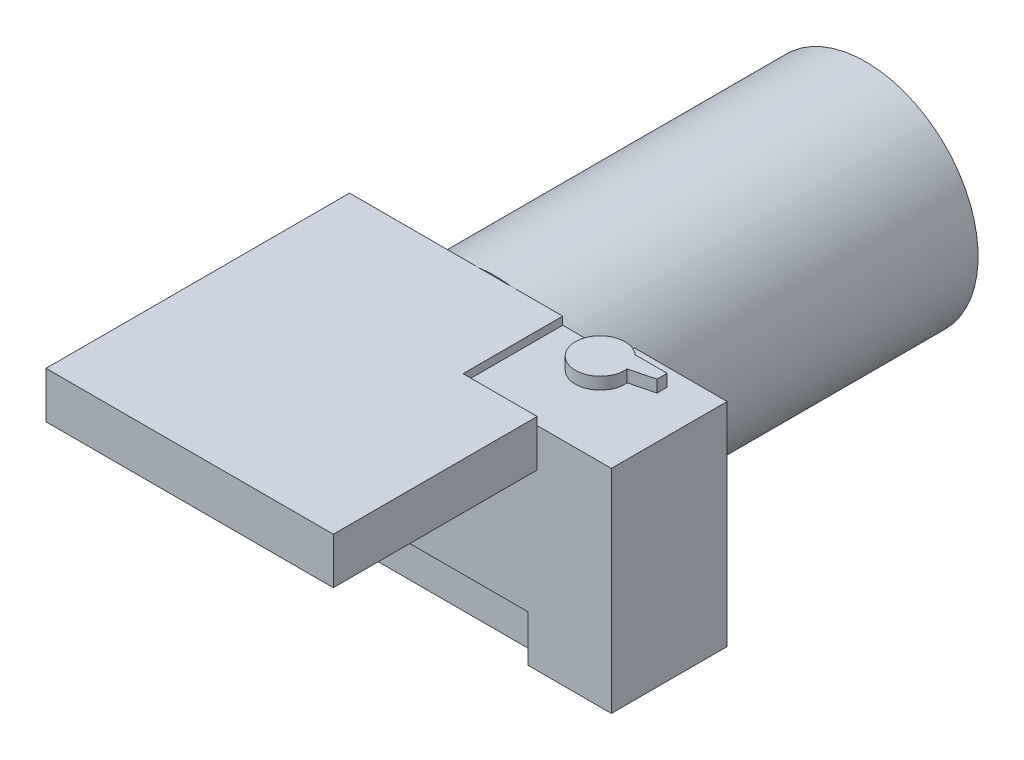
ISO-10303-21;
HEADER;
FILE_DESCRIPTION(('STEP AP214'),'2;1');
FILE_NAME('part.step','',(''),(''),'','','');
FILE_SCHEMA(('AUTOMOTIVE_DESIGN { 1 0 10303 214 1 1 1 1 }'));
ENDSEC;
DATA;
#1=APPLICATION_CONTEXT('core data for automotive mechanical design processes');
#2=APPLICATION_PROTOCOL_DEFINITION('international standard','automotive_design',2000,#1);
#3=PRODUCT_CONTEXT('',#1,'mechanical');
#4=PRODUCT('Part','Part','',(#3));
#5=PRODUCT_RELATED_PRODUCT_CATEGORY('part','',(#4));
#6=PRODUCT_DEFINITION_FORMATION('','',#4);
#7=PRODUCT_DEFINITION_CONTEXT('part definition',#1,'design');
#8=PRODUCT_DEFINITION('design','',#6,#7);
#9=PRODUCT_DEFINITION_SHAPE('','',#8);
#10=(LENGTH_UNIT() NAMED_UNIT(*) SI_UNIT(.MILLI.,.METRE.));
#11=(NAMED_UNIT(*) PLANE_ANGLE_UNIT() SI_UNIT($,.RADIAN.));
#12=(NAMED_UNIT(*) SI_UNIT($,.STERADIAN.) SOLID_ANGLE_UNIT());
#13=UNCERTAINTY_MEASURE_WITH_UNIT(LENGTH_MEASURE(1.E-05),#10,'distance_accuracy_value','');
#14=(GEOMETRIC_REPRESENTATION_CONTEXT(3) GLOBAL_UNCERTAINTY_ASSIGNED_CONTEXT((#13)) GLOBAL_UNIT_ASSIGNED_CONTEXT((#10,
#11,#12)) REPRESENTATION_CONTEXT('',''));
#15=CARTESIAN_POINT('',(0.,0.,0.));
#16=DIRECTION('',(0.,0.,1.));
#17=DIRECTION('',(1.,0.,0.));
#18=AXIS2_PLACEMENT_3D('',#15,#16,#17);
#19=CARTESIAN_POINT('',(0.,58.166,0.));
#20=DIRECTION('',(0.,0.,-1.));
#21=DIRECTION('',(-1.,0.,0.));
#22=AXIS2_PLACEMENT_3D('',#19,#20,#21);
#23=PLANE('',#22);
#24=DIRECTION('',(0.,1.,0.));
#25=VECTOR('',#24,1.);
#26=CARTESIAN_POINT('',(78.74,47.625,0.));
#27=LINE('',#26,#25);
#28=CARTESIAN_POINT('',(78.74,47.625,0.));
#29=VERTEX_POINT('',#28);
#30=CARTESIAN_POINT('',(78.74,58.166,0.));
#31=VERTEX_POINT('',#30);
#32=EDGE_CURVE('E387',#29,#31,#27,.T.);
#33=ORIENTED_EDGE('',*,*,#32,.F.);
#34=DIRECTION('',(-1.,0.,0.));
#35=VECTOR('',#34,1.);
#36=CARTESIAN_POINT('',(0.,47.625,0.));
#37=LINE('',#36,#35);
#38=CARTESIAN_POINT('',(0.,47.625,0.));
#39=VERTEX_POINT('',#38);
#40=EDGE_CURVE('E206',#29,#39,#37,.T.);
#41=ORIENTED_EDGE('',*,*,#40,.T.);
#42=DIRECTION('',(0.,-1.,0.));
#43=VECTOR('',#42,1.);
#44=CARTESIAN_POINT('',(0.,58.166,0.));
#45=LINE('',#44,#43);
#46=CARTESIAN_POINT('',(0.,12.7,0.));
#47=VERTEX_POINT('',#46);
#48=EDGE_CURVE('E215',#39,#47,#45,.T.);
#49=ORIENTED_EDGE('',*,*,#48,.T.);
#50=DIRECTION('',(1.,0.,0.));
#51=VECTOR('',#50,1.);
#52=CARTESIAN_POINT('',(0.,12.7,0.));
#53=LINE('',#52,#51);
#54=CARTESIAN_POINT('',(76.2,12.7,0.));
#55=VERTEX_POINT('',#54);
#56=EDGE_CURVE('E395',#47,#55,#53,.T.);
#57=ORIENTED_EDGE('',*,*,#56,.T.);
#58=DIRECTION('',(0.,-1.,0.));
#59=VECTOR('',#58,1.);
#60=CARTESIAN_POINT('',(76.2,12.7,0.));
#61=LINE('',#60,#59);
#62=CARTESIAN_POINT('',(76.2,0.,0.));
#63=VERTEX_POINT('',#62);
#64=EDGE_CURVE('E244',#55,#63,#61,.T.);
#65=ORIENTED_EDGE('',*,*,#64,.T.);
#66=DIRECTION('',(1.,0.,0.));
#67=VECTOR('',#66,1.);
#68=CARTESIAN_POINT('',(0.,0.,0.));
#69=LINE('',#68,#67);
#70=CARTESIAN_POINT('',(99.06,0.,0.));
#71=VERTEX_POINT('',#70);
#72=EDGE_CURVE('E306',#63,#71,#69,.T.);
#73=ORIENTED_EDGE('',*,*,#72,.T.);
#74=DIRECTION('',(0.,-1.,0.));
#75=VECTOR('',#74,1.);
#76=CARTESIAN_POINT('',(99.06,58.166,0.));
#77=LINE('',#76,#75);
#78=CARTESIAN_POINT('',(99.06,58.166,0.));
#79=VERTEX_POINT('',#78);
#80=EDGE_CURVE('E356',#79,#71,#77,.T.);
#81=ORIENTED_EDGE('',*,*,#80,.F.);
#82=DIRECTION('',(1.,0.,0.));
#83=VECTOR('',#82,1.);
#84=CARTESIAN_POINT('',(0.,58.166,0.));
#85=LINE('',#84,#83);
#86=EDGE_CURVE('E313',#31,#79,#85,.T.);
#87=ORIENTED_EDGE('',*,*,#86,.F.);
#88=EDGE_LOOP('',(#33,#41,#49,#57,#65,#73,#81,#87));
#89=FACE_BOUND('',#88,.T.);
#90=ADVANCED_FACE('F35',(#89),#23,.F.);
#91=CARTESIAN_POINT('',(0.,0.,0.));
#92=DIRECTION('',(0.,1.,0.));
#93=DIRECTION('',(0.,0.,1.));
#94=AXIS2_PLACEMENT_3D('',#91,#92,#93);
#95=PLANE('',#94);
#96=CARTESIAN_POINT('',(39.878,0.,-17.145));
#97=DIRECTION('',(0.,-1.,0.));
#98=DIRECTION('',(0.,0.,-1.));
#99=AXIS2_PLACEMENT_3D('',#96,#97,#98);
#100=CIRCLE('',#99,3.175);
#101=CARTESIAN_POINT('',(39.878,0.,-20.32));
#102=VERTEX_POINT('',#101);
#103=EDGE_CURVE('E297',#102,#102,#100,.T.);
#104=ORIENTED_EDGE('',*,*,#103,.F.);
#105=EDGE_LOOP('',(#104));
#106=FACE_BOUND('',#105,.T.);
#107=DIRECTION('',(0.,0.,-1.));
#108=VECTOR('',#107,1.);
#109=CARTESIAN_POINT('',(76.2,0.,0.));
#110=LINE('',#109,#108);
#111=CARTESIAN_POINT('',(76.2,0.,-4.064));
#112=VERTEX_POINT('',#111);
#113=EDGE_CURVE('E385',#63,#112,#110,.T.);
#114=ORIENTED_EDGE('',*,*,#113,.T.);
#115=DIRECTION('',(1.,0.,0.));
#116=VECTOR('',#115,1.);
#117=CARTESIAN_POINT('',(0.,0.,-4.064));
#118=LINE('',#117,#116);
#119=CARTESIAN_POINT('',(0.,0.,-4.064));
#120=VERTEX_POINT('',#119);
#121=EDGE_CURVE('E383',#120,#112,#118,.T.);
#122=ORIENTED_EDGE('',*,*,#121,.F.);
#123=DIRECTION('',(0.,0.,-1.));
#124=VECTOR('',#123,1.);
#125=CARTESIAN_POINT('',(0.,0.,0.));
#126=LINE('',#125,#124);
#127=CARTESIAN_POINT('',(0.,0.,-27.305));
#128=VERTEX_POINT('',#127);
#129=EDGE_CURVE('E338',#120,#128,#126,.T.);
#130=ORIENTED_EDGE('',*,*,#129,.T.);
#131=DIRECTION('',(1.,0.,0.));
#132=VECTOR('',#131,1.);
#133=CARTESIAN_POINT('',(0.,0.,-27.305));
#134=LINE('',#133,#132);
#135=CARTESIAN_POINT('',(32.277869655723,0.,-27.305));
#136=VERTEX_POINT('',#135);
#137=EDGE_CURVE('E335',#128,#136,#134,.T.);
#138=ORIENTED_EDGE('',*,*,#137,.T.);
#139=CARTESIAN_POINT('',(47.478130344277,0.,-27.305));
#140=VERTEX_POINT('',#139);
#141=EDGE_CURVE('E339',#136,#140,#134,.T.);
#142=ORIENTED_EDGE('',*,*,#141,.T.);
#143=CARTESIAN_POINT('',(73.66,0.,-27.305));
#144=VERTEX_POINT('',#143);
#145=EDGE_CURVE('E334',#140,#144,#134,.T.);
#146=ORIENTED_EDGE('',*,*,#145,.T.);
#147=DIRECTION('',(0.,0.,-1.));
#148=VECTOR('',#147,1.);
#149=CARTESIAN_POINT('',(73.66,0.,0.));
#150=LINE('',#149,#148);
#151=CARTESIAN_POINT('',(73.66,0.,-31.75));
#152=VERTEX_POINT('',#151);
#153=EDGE_CURVE('E331',#144,#152,#150,.T.);
#154=ORIENTED_EDGE('',*,*,#153,.T.);
#155=DIRECTION('',(-1.,0.,0.));
#156=VECTOR('',#155,1.);
#157=CARTESIAN_POINT('',(0.,0.,-31.75));
#158=LINE('',#157,#156);
#159=CARTESIAN_POINT('',(99.06,0.,-31.75));
#160=VERTEX_POINT('',#159);
#161=EDGE_CURVE('E328',#160,#152,#158,.T.);
#162=ORIENTED_EDGE('',*,*,#161,.F.);
#163=DIRECTION('',(0.,0.,-1.));
#164=VECTOR('',#163,1.);
#165=CARTESIAN_POINT('',(99.06,0.,0.));
#166=LINE('',#165,#164);
#167=EDGE_CURVE('E326',#71,#160,#166,.T.);
#168=ORIENTED_EDGE('',*,*,#167,.F.);
#169=ORIENTED_EDGE('',*,*,#72,.F.);
#170=EDGE_LOOP('',(#114,#122,#130,#138,#142,#146,#154,#162,#168,#169));
#171=FACE_BOUND('',#170,.T.);
#172=ADVANCED_FACE('F382',(#106,#171),#95,.F.);
#173=CARTESIAN_POINT('',(0.,58.166,0.));
#174=DIRECTION('',(0.,1.,0.));
#175=DIRECTION('',(0.,0.,1.));
#176=AXIS2_PLACEMENT_3D('',#173,#174,#175);
#177=PLANE('',#176);
#178=DIRECTION('',(1.,0.,0.));
#179=VECTOR('',#178,1.);
#180=CARTESIAN_POINT('',(0.,58.166,-27.305));
#181=LINE('',#180,#179);
#182=CARTESIAN_POINT('',(58.42,58.166,-27.305));
#183=VERTEX_POINT('',#182);
#184=CARTESIAN_POINT('',(70.1253883132312,58.166,-27.305));
#185=VERTEX_POINT('',#184);
#186=EDGE_CURVE('E323',#183,#185,#181,.T.);
#187=ORIENTED_EDGE('',*,*,#186,.F.);
#188=DIRECTION('',(0.,0.,-1.));
#189=VECTOR('',#188,1.);
#190=CARTESIAN_POINT('',(58.42,58.166,0.));
#191=LINE('',#190,#189);
#192=CARTESIAN_POINT('',(58.42,58.166,0.));
#193=VERTEX_POINT('',#192);
#194=EDGE_CURVE('E236',#193,#183,#191,.T.);
#195=ORIENTED_EDGE('',*,*,#194,.F.);
#196=EDGE_CURVE('E309',#193,#31,#85,.T.);
#197=ORIENTED_EDGE('',*,*,#196,.T.);
#198=ORIENTED_EDGE('',*,*,#86,.T.);
#199=DIRECTION('',(0.,0.,-1.));
#200=VECTOR('',#199,1.);
#201=CARTESIAN_POINT('',(99.06,58.166,0.));
#202=LINE('',#201,#200);
#203=CARTESIAN_POINT('',(99.06,58.166,-31.75));
#204=VERTEX_POINT('',#203);
#205=EDGE_CURVE('E312',#79,#204,#202,.T.);
#206=ORIENTED_EDGE('',*,*,#205,.T.);
#207=DIRECTION('',(-1.,0.,0.));
#208=VECTOR('',#207,1.);
#209=CARTESIAN_POINT('',(0.,58.166,-31.75));
#210=LINE('',#209,#208);
#211=CARTESIAN_POINT('',(73.66,58.166,-31.75));
#212=VERTEX_POINT('',#211);
#213=EDGE_CURVE('E315',#204,#212,#210,.T.);
#214=ORIENTED_EDGE('',*,*,#213,.T.);
#215=DIRECTION('',(0.,0.,-1.));
#216=VECTOR('',#215,1.);
#217=CARTESIAN_POINT('',(73.66,58.166,0.));
#218=LINE('',#217,#216);
#219=CARTESIAN_POINT('',(73.66,58.166,-28.6194827318797));
#220=VERTEX_POINT('',#219);
#221=EDGE_CURVE('E318',#220,#212,#218,.T.);
#222=ORIENTED_EDGE('',*,*,#221,.F.);
#223=CARTESIAN_POINT('',(74.168,58.166,-21.844));
#224=DIRECTION('',(0.,1.,0.));
#225=DIRECTION('',(0.,0.,1.));
#226=AXIS2_PLACEMENT_3D('',#223,#224,#225);
#227=CIRCLE('',#226,6.79449999999999);
#228=CARTESIAN_POINT('',(78.6800760465666,58.166,-26.924));
#229=VERTEX_POINT('',#228);
#230=EDGE_CURVE('E269',#229,#220,#227,.T.);
#231=ORIENTED_EDGE('',*,*,#230,.F.);
#232=DIRECTION('',(1.,0.,0.));
#233=VECTOR('',#232,1.);
#234=CARTESIAN_POINT('',(0.,58.166,-26.924));
#235=LINE('',#234,#233);
#236=CARTESIAN_POINT('',(87.4395,58.166,-26.924));
#237=VERTEX_POINT('',#236);
#238=EDGE_CURVE('E259',#229,#237,#235,.T.);
#239=ORIENTED_EDGE('',*,*,#238,.T.);
#240=DIRECTION('',(0.,0.,1.));
#241=VECTOR('',#240,1.);
#242=CARTESIAN_POINT('',(87.4395,58.166,0.));
#243=LINE('',#242,#241);
#244=CARTESIAN_POINT('',(87.4395,58.166,-24.13));
#245=VERTEX_POINT('',#244);
#246=EDGE_CURVE('E274',#237,#245,#243,.T.);
#247=ORIENTED_EDGE('',*,*,#246,.T.);
#248=DIRECTION('',(-0.969284230400954,0.,0.245943246900644));
#249=VECTOR('',#248,1.);
#250=CARTESIAN_POINT('',(-0.463276885448311,58.166,-1.82581544739759));
#251=LINE('',#250,#249);
#252=CARTESIAN_POINT('',(80.9327620246391,58.166,-22.479));
#253=VERTEX_POINT('',#252);
#254=EDGE_CURVE('E272',#245,#253,#251,.T.);
#255=ORIENTED_EDGE('',*,*,#254,.T.);
#256=CARTESIAN_POINT('',(74.168,58.166,-21.844));
#257=DIRECTION('',(0.,1.,0.));
#258=DIRECTION('',(0.,0.,1.));
#259=AXIS2_PLACEMENT_3D('',#256,#257,#258);
#260=CIRCLE('',#259,6.79449999999999);
#261=EDGE_CURVE('E43',#253,#185,#260,.F.);
#262=ORIENTED_EDGE('',*,*,#261,.T.);
#263=EDGE_LOOP('',(#187,#195,#197,#198,#206,#214,#222,#231,#239,#247,#255,#262));
#264=FACE_BOUND('',#263,.T.);
#265=ADVANCED_FACE('F461',(#264),#177,.T.);
#266=CARTESIAN_POINT('',(39.878,29.845,-128.905));
#267=DIRECTION('',(0.,0.,1.));
#268=DIRECTION('',(1.,0.,0.));
#269=AXIS2_PLACEMENT_3D('',#266,#267,#268);
#270=CYLINDRICAL_SURFACE('',#269,30.7975);
#271=CARTESIAN_POINT('',(39.878,29.845,-128.905));
#272=DIRECTION('',(0.,0.,-1.));
#273=DIRECTION('',(-1.,0.,0.));
#274=AXIS2_PLACEMENT_3D('',#271,#272,#273);
#275=CIRCLE('',#274,30.7975);
#276=CARTESIAN_POINT('',(9.08050000000001,29.845,-128.905));
#277=VERTEX_POINT('',#276);
#278=EDGE_CURVE('E294',#277,#277,#275,.T.);
#279=ORIENTED_EDGE('',*,*,#278,.F.);
#280=EDGE_LOOP('',(#279));
#281=FACE_BOUND('',#280,.T.);
#282=DIRECTION('',(0.,0.,1.));
#283=VECTOR('',#282,1.);
#284=CARTESIAN_POINT('',(15.868953557659,10.5563583894688,-28.575));
#285=LINE('',#284,#283);
#286=CARTESIAN_POINT('',(15.868953557659,10.5563583894688,-29.845));
#287=VERTEX_POINT('',#286);
#288=CARTESIAN_POINT('',(15.868953557659,10.5563583894688,-27.305));
#289=VERTEX_POINT('',#288);
#290=EDGE_CURVE('E348',#287,#289,#285,.T.);
#291=ORIENTED_EDGE('',*,*,#290,.F.);
#292=CARTESIAN_POINT('',(39.878,29.845,-29.845));
#293=DIRECTION('',(0.,0.,-1.));
#294=DIRECTION('',(-1.,0.,0.));
#295=AXIS2_PLACEMENT_3D('',#292,#293,#294);
#296=CIRCLE('',#295,30.7975);
#297=CARTESIAN_POINT('',(14.1303428612599,12.9469480970177,-29.845));
#298=VERTEX_POINT('',#297);
#299=EDGE_CURVE('E353',#287,#298,#296,.T.);
#300=ORIENTED_EDGE('',*,*,#299,.T.);
#301=DIRECTION('',(0.,0.,1.));
#302=VECTOR('',#301,1.);
#303=CARTESIAN_POINT('',(14.1303428612599,12.9469480970177,-28.575));
#304=LINE('',#303,#302);
#305=CARTESIAN_POINT('',(14.1303428612599,12.9469480970177,-27.305));
#306=VERTEX_POINT('',#305);
#307=EDGE_CURVE('E350',#306,#298,#304,.F.);
#308=ORIENTED_EDGE('',*,*,#307,.F.);
#309=CARTESIAN_POINT('',(39.878,29.845,-27.305));
#310=DIRECTION('',(0.,0.,-1.));
#311=DIRECTION('',(-1.,0.,0.));
#312=AXIS2_PLACEMENT_3D('',#309,#310,#311);
#313=CIRCLE('',#312,30.7975);
#314=CARTESIAN_POINT('',(35.4671490333497,60.325,-27.305));
#315=VERTEX_POINT('',#314);
#316=EDGE_CURVE('E298',#306,#315,#313,.T.);
#317=ORIENTED_EDGE('',*,*,#316,.T.);
#318=CARTESIAN_POINT('',(44.2888509666503,60.325,-27.305));
#319=VERTEX_POINT('',#318);
#320=EDGE_CURVE('E301',#315,#319,#313,.T.);
#321=ORIENTED_EDGE('',*,*,#320,.T.);
#322=EDGE_CURVE('E302',#319,#140,#313,.T.);
#323=ORIENTED_EDGE('',*,*,#322,.T.);
#324=EDGE_CURVE('E412',#140,#136,#313,.T.);
#325=ORIENTED_EDGE('',*,*,#324,.T.);
#326=EDGE_CURVE('E291',#136,#289,#313,.T.);
#327=ORIENTED_EDGE('',*,*,#326,.T.);
#328=EDGE_LOOP('',(#291,#300,#308,#317,#321,#323,#325,#327));
#329=FACE_BOUND('',#328,.T.);
#330=ADVANCED_FACE('F406',(#281,#329),#270,.T.);
#331=CARTESIAN_POINT('',(0.,58.166,-27.305));
#332=DIRECTION('',(0.,0.,-1.));
#333=DIRECTION('',(-1.,0.,0.));
#334=AXIS2_PLACEMENT_3D('',#331,#332,#333);
#335=PLANE('',#334);
#336=ORIENTED_EDGE('',*,*,#145,.F.);
#337=ORIENTED_EDGE('',*,*,#322,.F.);
#338=DIRECTION('',(1.,0.,0.));
#339=VECTOR('',#338,1.);
#340=CARTESIAN_POINT('',(0.,60.325,-27.305));
#341=LINE('',#340,#339);
#342=CARTESIAN_POINT('',(58.42,60.325,-27.305));
#343=VERTEX_POINT('',#342);
#344=EDGE_CURVE('E235',#319,#343,#341,.T.);
#345=ORIENTED_EDGE('',*,*,#344,.T.);
#346=DIRECTION('',(0.,-1.,0.));
#347=VECTOR('',#346,1.);
#348=CARTESIAN_POINT('',(58.42,60.325,-27.305));
#349=LINE('',#348,#347);
#350=EDGE_CURVE('E231',#343,#183,#349,.T.);
#351=ORIENTED_EDGE('',*,*,#350,.T.);
#352=ORIENTED_EDGE('',*,*,#186,.T.);
#353=CARTESIAN_POINT('',(73.66,58.166,-27.305));
#354=VERTEX_POINT('',#353);
#355=EDGE_CURVE('E322',#185,#354,#181,.T.);
#356=ORIENTED_EDGE('',*,*,#355,.T.);
#357=DIRECTION('',(0.,-1.,0.));
#358=VECTOR('',#357,1.);
#359=CARTESIAN_POINT('',(73.66,58.166,-27.305));
#360=LINE('',#359,#358);
#361=EDGE_CURVE('E363',#354,#144,#360,.T.);
#362=ORIENTED_EDGE('',*,*,#361,.T.);
#363=EDGE_LOOP('',(#336,#337,#345,#351,#352,#356,#362));
#364=FACE_BOUND('',#363,.T.);
#365=ADVANCED_FACE('F415',(#364),#335,.T.);
#366=CARTESIAN_POINT('',(99.06,58.166,0.));
#367=DIRECTION('',(-1.,0.,0.));
#368=DIRECTION('',(0.,0.,1.));
#369=AXIS2_PLACEMENT_3D('',#366,#367,#368);
#370=PLANE('',#369);
#371=ORIENTED_EDGE('',*,*,#167,.T.);
#372=DIRECTION('',(0.,-1.,0.));
#373=VECTOR('',#372,1.);
#374=CARTESIAN_POINT('',(99.06,58.166,-31.75));
#375=LINE('',#374,#373);
#376=EDGE_CURVE('E359',#204,#160,#375,.T.);
#377=ORIENTED_EDGE('',*,*,#376,.F.);
#378=ORIENTED_EDGE('',*,*,#205,.F.);
#379=ORIENTED_EDGE('',*,*,#80,.T.);
#380=EDGE_LOOP('',(#371,#377,#378,#379));
#381=FACE_BOUND('',#380,.T.);
#382=ADVANCED_FACE('F428',(#381),#370,.F.);
#383=CARTESIAN_POINT('',(0.,58.166,-31.75));
#384=DIRECTION('',(0.,0.,1.));
#385=DIRECTION('',(1.,0.,0.));
#386=AXIS2_PLACEMENT_3D('',#383,#384,#385);
#387=PLANE('',#386);
#388=ORIENTED_EDGE('',*,*,#161,.T.);
#389=DIRECTION('',(0.,-1.,0.));
#390=VECTOR('',#389,1.);
#391=CARTESIAN_POINT('',(73.66,58.166,-31.75));
#392=LINE('',#391,#390);
#393=EDGE_CURVE('E362',#212,#152,#392,.T.);
#394=ORIENTED_EDGE('',*,*,#393,.F.);
#395=ORIENTED_EDGE('',*,*,#213,.F.);
#396=ORIENTED_EDGE('',*,*,#376,.T.);
#397=EDGE_LOOP('',(#388,#394,#395,#396));
#398=FACE_BOUND('',#397,.T.);
#399=ADVANCED_FACE('F424',(#398),#387,.F.);
#400=CARTESIAN_POINT('',(73.66,58.166,0.));
#401=DIRECTION('',(-1.,0.,0.));
#402=DIRECTION('',(0.,0.,1.));
#403=AXIS2_PLACEMENT_3D('',#400,#401,#402);
#404=PLANE('',#403);
#405=ORIENTED_EDGE('',*,*,#153,.F.);
#406=ORIENTED_EDGE('',*,*,#361,.F.);
#407=EDGE_CURVE('E319',#354,#220,#218,.T.);
#408=ORIENTED_EDGE('',*,*,#407,.T.);
#409=ORIENTED_EDGE('',*,*,#221,.T.);
#410=ORIENTED_EDGE('',*,*,#393,.T.);
#411=EDGE_LOOP('',(#405,#406,#408,#409,#410));
#412=FACE_BOUND('',#411,.T.);
#413=ADVANCED_FACE('F419',(#412),#404,.T.);
#414=ORIENTED_EDGE('',*,*,#316,.F.);
#415=CARTESIAN_POINT('',(11.938,9.525,-27.305));
#416=DIRECTION('',(0.,0.,-1.));
#417=DIRECTION('',(-1.,0.,0.));
#418=AXIS2_PLACEMENT_3D('',#415,#416,#417);
#419=CIRCLE('',#418,4.064);
#420=EDGE_CURVE('E288',#289,#306,#419,.T.);
#421=ORIENTED_EDGE('',*,*,#420,.F.);
#422=ORIENTED_EDGE('',*,*,#326,.F.);
#423=ORIENTED_EDGE('',*,*,#137,.F.);
#424=DIRECTION('',(0.,-1.,0.));
#425=VECTOR('',#424,1.);
#426=CARTESIAN_POINT('',(0.,58.166,-27.305));
#427=LINE('',#426,#425);
#428=CARTESIAN_POINT('',(0.,60.325,-27.305));
#429=VERTEX_POINT('',#428);
#430=EDGE_CURVE('E343',#429,#128,#427,.T.);
#431=ORIENTED_EDGE('',*,*,#430,.F.);
#432=EDGE_CURVE('E241',#429,#315,#341,.T.);
#433=ORIENTED_EDGE('',*,*,#432,.T.);
#434=EDGE_LOOP('',(#414,#421,#422,#423,#431,#433));
#435=FACE_BOUND('',#434,.T.);
#436=ADVANCED_FACE('F376',(#435),#335,.T.);
#437=CARTESIAN_POINT('',(0.,58.166,0.));
#438=DIRECTION('',(-1.,0.,0.));
#439=DIRECTION('',(0.,0.,1.));
#440=AXIS2_PLACEMENT_3D('',#437,#438,#439);
#441=PLANE('',#440);
#442=DIRECTION('',(0.,-1.,0.));
#443=VECTOR('',#442,1.);
#444=CARTESIAN_POINT('',(0.,12.7,-4.064));
#445=LINE('',#444,#443);
#446=CARTESIAN_POINT('',(0.,12.7,-4.064));
#447=VERTEX_POINT('',#446);
#448=EDGE_CURVE('E59',#447,#120,#445,.T.);
#449=ORIENTED_EDGE('',*,*,#448,.F.);
#450=DIRECTION('',(0.,0.,-1.));
#451=VECTOR('',#450,1.);
#452=CARTESIAN_POINT('',(0.,12.7,0.));
#453=LINE('',#452,#451);
#454=EDGE_CURVE('E389',#47,#447,#453,.T.);
#455=ORIENTED_EDGE('',*,*,#454,.F.);
#456=ORIENTED_EDGE('',*,*,#48,.F.);
#457=DIRECTION('',(0.,0.,1.));
#458=VECTOR('',#457,1.);
#459=CARTESIAN_POINT('',(0.,47.625,0.));
#460=LINE('',#459,#458);
#461=CARTESIAN_POINT('',(0.,47.625,55.88));
#462=VERTEX_POINT('',#461);
#463=EDGE_CURVE('E51',#39,#462,#460,.T.);
#464=ORIENTED_EDGE('',*,*,#463,.T.);
#465=DIRECTION('',(0.,1.,0.));
#466=VECTOR('',#465,1.);
#467=CARTESIAN_POINT('',(0.,47.625,55.88));
#468=LINE('',#467,#466);
#469=CARTESIAN_POINT('',(0.,60.325,55.88));
#470=VERTEX_POINT('',#469);
#471=EDGE_CURVE('E198',#462,#470,#468,.T.);
#472=ORIENTED_EDGE('',*,*,#471,.T.);
#473=DIRECTION('',(0.,0.,-1.));
#474=VECTOR('',#473,1.);
#475=CARTESIAN_POINT('',(0.,60.325,0.));
#476=LINE('',#475,#474);
#477=EDGE_CURVE('E254',#470,#429,#476,.T.);
#478=ORIENTED_EDGE('',*,*,#477,.T.);
#479=ORIENTED_EDGE('',*,*,#430,.T.);
#480=ORIENTED_EDGE('',*,*,#129,.F.);
#481=EDGE_LOOP('',(#449,#455,#456,#464,#472,#478,#479,#480));
#482=FACE_BOUND('',#481,.T.);
#483=ADVANCED_FACE('F213',(#482),#441,.T.);
#484=CARTESIAN_POINT('',(39.878,25.4,-17.145));
#485=DIRECTION('',(0.,-1.,0.));
#486=DIRECTION('',(0.,0.,-1.));
#487=AXIS2_PLACEMENT_3D('',#484,#485,#486);
#488=CYLINDRICAL_SURFACE('',#487,3.175);
#489=CARTESIAN_POINT('',(39.878,25.4,-17.145));
#490=DIRECTION('',(0.,-1.,0.));
#491=DIRECTION('',(0.,0.,-1.));
#492=AXIS2_PLACEMENT_3D('',#489,#490,#491);
#493=CIRCLE('',#492,3.175);
#494=CARTESIAN_POINT('',(39.878,25.4,-20.32));
#495=VERTEX_POINT('',#494);
#496=EDGE_CURVE('E303',#495,#495,#493,.T.);
#497=ORIENTED_EDGE('',*,*,#496,.F.);
#498=EDGE_LOOP('',(#497));
#499=FACE_BOUND('',#498,.T.);
#500=ORIENTED_EDGE('',*,*,#103,.T.);
#501=EDGE_LOOP('',(#500));
#502=FACE_BOUND('',#501,.T.);
#503=ADVANCED_FACE('F515',(#499,#502),#488,.F.);
#504=CARTESIAN_POINT('',(39.878,25.4,-17.145));
#505=DIRECTION('',(0.,-1.,0.));
#506=DIRECTION('',(0.,0.,-1.));
#507=AXIS2_PLACEMENT_3D('',#504,#505,#506);
#508=PLANE('',#507);
#509=ORIENTED_EDGE('',*,*,#496,.T.);
#510=EDGE_LOOP('',(#509));
#511=FACE_BOUND('',#510,.T.);
#512=ADVANCED_FACE('F538',(#511),#508,.T.);
#513=CARTESIAN_POINT('',(0.,0.,-27.305));
#514=DIRECTION('',(0.,0.,-1.));
#515=DIRECTION('',(-1.,0.,0.));
#516=AXIS2_PLACEMENT_3D('',#513,#514,#515);
#517=PLANE('',#516);
#518=ORIENTED_EDGE('',*,*,#324,.F.);
#519=ORIENTED_EDGE('',*,*,#141,.F.);
#520=EDGE_LOOP('',(#518,#519));
#521=FACE_BOUND('',#520,.T.);
#522=ADVANCED_FACE('F414',(#521),#517,.F.);
#523=CARTESIAN_POINT('',(0.,0.,-128.905));
#524=DIRECTION('',(0.,0.,-1.));
#525=DIRECTION('',(-1.,0.,0.));
#526=AXIS2_PLACEMENT_3D('',#523,#524,#525);
#527=PLANE('',#526);
#528=ORIENTED_EDGE('',*,*,#278,.T.);
#529=EDGE_LOOP('',(#528));
#530=FACE_BOUND('',#529,.T.);
#531=ADVANCED_FACE('F560',(#530),#527,.T.);
#532=ORIENTED_EDGE('',*,*,#320,.F.);
#533=DIRECTION('',(1.,0.,0.));
#534=VECTOR('',#533,1.);
#535=CARTESIAN_POINT('',(0.,60.325,-27.305));
#536=LINE('',#535,#534);
#537=EDGE_CURVE('E11',#315,#319,#536,.T.);
#538=ORIENTED_EDGE('',*,*,#537,.T.);
#539=EDGE_LOOP('',(#532,#538));
#540=FACE_BOUND('',#539,.T.);
#541=ADVANCED_FACE('F402',(#540),#517,.F.);
#542=CARTESIAN_POINT('',(11.938,9.525,-29.845));
#543=DIRECTION('',(0.,0.,1.));
#544=DIRECTION('',(1.,0.,0.));
#545=AXIS2_PLACEMENT_3D('',#542,#543,#544);
#546=CYLINDRICAL_SURFACE('',#545,4.064);
#547=CARTESIAN_POINT('',(11.938,9.525,-29.845));
#548=DIRECTION('',(0.,0.,-1.));
#549=DIRECTION('',(-1.,0.,0.));
#550=AXIS2_PLACEMENT_3D('',#547,#548,#549);
#551=CIRCLE('',#550,4.064);
#552=EDGE_CURVE('E289',#287,#298,#551,.T.);
#553=ORIENTED_EDGE('',*,*,#552,.F.);
#554=ORIENTED_EDGE('',*,*,#290,.T.);
#555=ORIENTED_EDGE('',*,*,#420,.T.);
#556=ORIENTED_EDGE('',*,*,#307,.T.);
#557=EDGE_LOOP('',(#553,#554,#555,#556));
#558=FACE_BOUND('',#557,.T.);
#559=ADVANCED_FACE('F409',(#558),#546,.T.);
#560=CARTESIAN_POINT('',(11.938,9.525,-29.845));
#561=DIRECTION('',(0.,0.,-1.));
#562=DIRECTION('',(-1.,0.,0.));
#563=AXIS2_PLACEMENT_3D('',#560,#561,#562);
#564=PLANE('',#563);
#565=ORIENTED_EDGE('',*,*,#299,.F.);
#566=ORIENTED_EDGE('',*,*,#552,.T.);
#567=EDGE_LOOP('',(#565,#566));
#568=FACE_BOUND('',#567,.T.);
#569=ADVANCED_FACE('F581',(#568),#564,.T.);
#570=CARTESIAN_POINT('',(74.168,61.468,-21.844));
#571=DIRECTION('',(0.,-1.,0.));
#572=DIRECTION('',(0.,0.,-1.));
#573=AXIS2_PLACEMENT_3D('',#570,#571,#572);
#574=CYLINDRICAL_SURFACE('',#573,6.79449999999999);
#575=ORIENTED_EDGE('',*,*,#230,.T.);
#576=EDGE_CURVE('E230',#220,#185,#227,.T.);
#577=ORIENTED_EDGE('',*,*,#576,.T.);
#578=ORIENTED_EDGE('',*,*,#261,.F.);
#579=DIRECTION('',(0.,-1.,0.));
#580=VECTOR('',#579,1.);
#581=CARTESIAN_POINT('',(80.9327620246391,61.468,-22.479));
#582=LINE('',#581,#580);
#583=CARTESIAN_POINT('',(80.9327620246391,61.468,-22.479));
#584=VERTEX_POINT('',#583);
#585=EDGE_CURVE('E285',#584,#253,#582,.T.);
#586=ORIENTED_EDGE('',*,*,#585,.F.);
#587=CARTESIAN_POINT('',(74.168,61.468,-21.844));
#588=DIRECTION('',(0.,1.,0.));
#589=DIRECTION('',(0.,0.,1.));
#590=AXIS2_PLACEMENT_3D('',#587,#588,#589);
#591=CIRCLE('',#590,6.79449999999999);
#592=CARTESIAN_POINT('',(78.6800760465666,61.468,-26.924));
#593=VERTEX_POINT('',#592);
#594=EDGE_CURVE('E256',#593,#584,#591,.T.);
#595=ORIENTED_EDGE('',*,*,#594,.F.);
#596=DIRECTION('',(0.,-1.,0.));
#597=VECTOR('',#596,1.);
#598=CARTESIAN_POINT('',(78.6800760465666,61.468,-26.924));
#599=LINE('',#598,#597);
#600=EDGE_CURVE('E268',#593,#229,#599,.T.);
#601=ORIENTED_EDGE('',*,*,#600,.T.);
#602=EDGE_LOOP('',(#575,#577,#578,#586,#595,#601));
#603=FACE_BOUND('',#602,.T.);
#604=ADVANCED_FACE('F469',(#603),#574,.T.);
#605=CARTESIAN_POINT('',(-0.463276885448311,61.468,-1.82581544739759));
#606=DIRECTION('',(0.245943246900644,0.,0.969284230400953));
#607=DIRECTION('',(0.969284230400954,0.,-0.245943246900644));
#608=AXIS2_PLACEMENT_3D('',#605,#606,#607);
#609=PLANE('',#608);
#610=ORIENTED_EDGE('',*,*,#254,.F.);
#611=DIRECTION('',(0.,-1.,0.));
#612=VECTOR('',#611,1.);
#613=CARTESIAN_POINT('',(87.4395,61.468,-24.13));
#614=LINE('',#613,#612);
#615=CARTESIAN_POINT('',(87.4395,61.468,-24.13));
#616=VERTEX_POINT('',#615);
#617=EDGE_CURVE('E282',#616,#245,#614,.T.);
#618=ORIENTED_EDGE('',*,*,#617,.F.);
#619=DIRECTION('',(-0.969284230400954,0.,0.245943246900644));
#620=VECTOR('',#619,1.);
#621=CARTESIAN_POINT('',(-0.463276885448311,61.468,-1.82581544739759));
#622=LINE('',#621,#620);
#623=EDGE_CURVE('E258',#616,#584,#622,.T.);
#624=ORIENTED_EDGE('',*,*,#623,.T.);
#625=ORIENTED_EDGE('',*,*,#585,.T.);
#626=EDGE_LOOP('',(#610,#618,#624,#625));
#627=FACE_BOUND('',#626,.T.);
#628=ADVANCED_FACE('F485',(#627),#609,.T.);
#629=CARTESIAN_POINT('',(87.4395,61.468,0.));
#630=DIRECTION('',(1.,0.,0.));
#631=DIRECTION('',(0.,0.,-1.));
#632=AXIS2_PLACEMENT_3D('',#629,#630,#631);
#633=PLANE('',#632);
#634=ORIENTED_EDGE('',*,*,#246,.F.);
#635=DIRECTION('',(0.,-1.,0.));
#636=VECTOR('',#635,1.);
#637=CARTESIAN_POINT('',(87.4395,61.468,-26.924));
#638=LINE('',#637,#636);
#639=CARTESIAN_POINT('',(87.4395,61.468,-26.924));
#640=VERTEX_POINT('',#639);
#641=EDGE_CURVE('E279',#640,#237,#638,.T.);
#642=ORIENTED_EDGE('',*,*,#641,.F.);
#643=DIRECTION('',(0.,0.,1.));
#644=VECTOR('',#643,1.);
#645=CARTESIAN_POINT('',(87.4395,61.468,0.));
#646=LINE('',#645,#644);
#647=EDGE_CURVE('E262',#640,#616,#646,.T.);
#648=ORIENTED_EDGE('',*,*,#647,.T.);
#649=ORIENTED_EDGE('',*,*,#617,.T.);
#650=EDGE_LOOP('',(#634,#642,#648,#649));
#651=FACE_BOUND('',#650,.T.);
#652=ADVANCED_FACE('F481',(#651),#633,.T.);
#653=CARTESIAN_POINT('',(0.,61.468,-26.924));
#654=DIRECTION('',(0.,0.,-1.));
#655=DIRECTION('',(-1.,0.,0.));
#656=AXIS2_PLACEMENT_3D('',#653,#654,#655);
#657=PLANE('',#656);
#658=ORIENTED_EDGE('',*,*,#238,.F.);
#659=ORIENTED_EDGE('',*,*,#600,.F.);
#660=DIRECTION('',(1.,0.,0.));
#661=VECTOR('',#660,1.);
#662=CARTESIAN_POINT('',(0.,61.468,-26.924));
#663=LINE('',#662,#661);
#664=EDGE_CURVE('E265',#593,#640,#663,.T.);
#665=ORIENTED_EDGE('',*,*,#664,.T.);
#666=ORIENTED_EDGE('',*,*,#641,.T.);
#667=EDGE_LOOP('',(#658,#659,#665,#666));
#668=FACE_BOUND('',#667,.T.);
#669=ADVANCED_FACE('F477',(#668),#657,.T.);
#670=CARTESIAN_POINT('',(0.,61.468,0.));
#671=DIRECTION('',(0.,1.,0.));
#672=DIRECTION('',(0.,0.,1.));
#673=AXIS2_PLACEMENT_3D('',#670,#671,#672);
#674=PLANE('',#673);
#675=ORIENTED_EDGE('',*,*,#594,.T.);
#676=ORIENTED_EDGE('',*,*,#623,.F.);
#677=ORIENTED_EDGE('',*,*,#647,.F.);
#678=ORIENTED_EDGE('',*,*,#664,.F.);
#679=EDGE_LOOP('',(#675,#676,#677,#678));
#680=FACE_BOUND('',#679,.T.);
#681=ADVANCED_FACE('F487',(#680),#674,.T.);
#682=CARTESIAN_POINT('',(0.,58.166,0.));
#683=DIRECTION('',(0.,1.,0.));
#684=DIRECTION('',(0.,0.,1.));
#685=AXIS2_PLACEMENT_3D('',#682,#683,#684);
#686=PLANE('',#685);
#687=ORIENTED_EDGE('',*,*,#355,.F.);
#688=ORIENTED_EDGE('',*,*,#576,.F.);
#689=ORIENTED_EDGE('',*,*,#407,.F.);
#690=EDGE_LOOP('',(#687,#688,#689));
#691=FACE_BOUND('',#690,.T.);
#692=ADVANCED_FACE('F467',(#691),#686,.F.);
#693=CARTESIAN_POINT('',(58.42,60.325,0.));
#694=DIRECTION('',(-1.,0.,0.));
#695=DIRECTION('',(0.,0.,1.));
#696=AXIS2_PLACEMENT_3D('',#693,#694,#695);
#697=PLANE('',#696);
#698=ORIENTED_EDGE('',*,*,#194,.T.);
#699=ORIENTED_EDGE('',*,*,#350,.F.);
#700=DIRECTION('',(0.,0.,-1.));
#701=VECTOR('',#700,1.);
#702=CARTESIAN_POINT('',(58.42,60.325,0.));
#703=LINE('',#702,#701);
#704=CARTESIAN_POINT('',(58.42,60.325,0.));
#705=VERTEX_POINT('',#704);
#706=EDGE_CURVE('E233',#705,#343,#703,.T.);
#707=ORIENTED_EDGE('',*,*,#706,.F.);
#708=DIRECTION('',(0.,-1.,0.));
#709=VECTOR('',#708,1.);
#710=CARTESIAN_POINT('',(58.42,60.325,0.));
#711=LINE('',#710,#709);
#712=EDGE_CURVE('E227',#705,#193,#711,.T.);
#713=ORIENTED_EDGE('',*,*,#712,.T.);
#714=EDGE_LOOP('',(#698,#699,#707,#713));
#715=FACE_BOUND('',#714,.T.);
#716=ADVANCED_FACE('F459',(#715),#697,.F.);
#717=CARTESIAN_POINT('',(0.,60.325,0.));
#718=DIRECTION('',(0.,1.,0.));
#719=DIRECTION('',(0.,0.,1.));
#720=AXIS2_PLACEMENT_3D('',#717,#718,#719);
#721=PLANE('',#720);
#722=ORIENTED_EDGE('',*,*,#477,.F.);
#723=DIRECTION('',(1.,0.,0.));
#724=VECTOR('',#723,1.);
#725=CARTESIAN_POINT('',(0.,60.325,55.88));
#726=LINE('',#725,#724);
#727=CARTESIAN_POINT('',(78.74,60.325,55.88));
#728=VERTEX_POINT('',#727);
#729=EDGE_CURVE('E202',#470,#728,#726,.T.);
#730=ORIENTED_EDGE('',*,*,#729,.T.);
#731=DIRECTION('',(0.,0.,-1.));
#732=VECTOR('',#731,1.);
#733=CARTESIAN_POINT('',(78.74,60.325,0.));
#734=LINE('',#733,#732);
#735=CARTESIAN_POINT('',(78.74,60.325,0.));
#736=VERTEX_POINT('',#735);
#737=EDGE_CURVE('E219',#728,#736,#734,.T.);
#738=ORIENTED_EDGE('',*,*,#737,.T.);
#739=DIRECTION('',(-1.,0.,0.));
#740=VECTOR('',#739,1.);
#741=CARTESIAN_POINT('',(0.,60.325,0.));
#742=LINE('',#741,#740);
#743=EDGE_CURVE('E216',#736,#705,#742,.T.);
#744=ORIENTED_EDGE('',*,*,#743,.T.);
#745=ORIENTED_EDGE('',*,*,#706,.T.);
#746=ORIENTED_EDGE('',*,*,#344,.F.);
#747=ORIENTED_EDGE('',*,*,#537,.F.);
#748=ORIENTED_EDGE('',*,*,#432,.F.);
#749=EDGE_LOOP('',(#722,#730,#738,#744,#745,#746,#747,#748));
#750=FACE_BOUND('',#749,.T.);
#751=ADVANCED_FACE('F457',(#750),#721,.T.);
#752=CARTESIAN_POINT('',(76.2,12.7,0.));
#753=DIRECTION('',(-1.,0.,0.));
#754=DIRECTION('',(0.,0.,1.));
#755=AXIS2_PLACEMENT_3D('',#752,#753,#754);
#756=PLANE('',#755);
#757=ORIENTED_EDGE('',*,*,#113,.F.);
#758=ORIENTED_EDGE('',*,*,#64,.F.);
#759=DIRECTION('',(0.,0.,-1.));
#760=VECTOR('',#759,1.);
#761=CARTESIAN_POINT('',(76.2,12.7,0.));
#762=LINE('',#761,#760);
#763=CARTESIAN_POINT('',(76.2,12.7,-4.064));
#764=VERTEX_POINT('',#763);
#765=EDGE_CURVE('E438',#55,#764,#762,.T.);
#766=ORIENTED_EDGE('',*,*,#765,.T.);
#767=DIRECTION('',(0.,-1.,0.));
#768=VECTOR('',#767,1.);
#769=CARTESIAN_POINT('',(76.2,12.7,-4.064));
#770=LINE('',#769,#768);
#771=EDGE_CURVE('E250',#764,#112,#770,.T.);
#772=ORIENTED_EDGE('',*,*,#771,.T.);
#773=EDGE_LOOP('',(#757,#758,#766,#772));
#774=FACE_BOUND('',#773,.T.);
#775=ADVANCED_FACE('F437',(#774),#756,.T.);
#776=CARTESIAN_POINT('',(0.,12.7,-4.064));
#777=DIRECTION('',(0.,0.,-1.));
#778=DIRECTION('',(-1.,0.,0.));
#779=AXIS2_PLACEMENT_3D('',#776,#777,#778);
#780=PLANE('',#779);
#781=ORIENTED_EDGE('',*,*,#121,.T.);
#782=ORIENTED_EDGE('',*,*,#771,.F.);
#783=DIRECTION('',(1.,0.,0.));
#784=VECTOR('',#783,1.);
#785=CARTESIAN_POINT('',(0.,12.7,-4.064));
#786=LINE('',#785,#784);
#787=EDGE_CURVE('E443',#447,#764,#786,.T.);
#788=ORIENTED_EDGE('',*,*,#787,.F.);
#789=ORIENTED_EDGE('',*,*,#448,.T.);
#790=EDGE_LOOP('',(#781,#782,#788,#789));
#791=FACE_BOUND('',#790,.T.);
#792=ADVANCED_FACE('F692',(#791),#780,.F.);
#793=CARTESIAN_POINT('',(0.,12.7,0.));
#794=DIRECTION('',(0.,-1.,0.));
#795=DIRECTION('',(0.,0.,-1.));
#796=AXIS2_PLACEMENT_3D('',#793,#794,#795);
#797=PLANE('',#796);
#798=ORIENTED_EDGE('',*,*,#454,.T.);
#799=ORIENTED_EDGE('',*,*,#787,.T.);
#800=ORIENTED_EDGE('',*,*,#765,.F.);
#801=ORIENTED_EDGE('',*,*,#56,.F.);
#802=EDGE_LOOP('',(#798,#799,#800,#801));
#803=FACE_BOUND('',#802,.T.);
#804=ADVANCED_FACE('F442',(#803),#797,.T.);
#805=CARTESIAN_POINT('',(0.,47.625,0.));
#806=DIRECTION('',(0.,0.,-1.));
#807=DIRECTION('',(-1.,0.,0.));
#808=AXIS2_PLACEMENT_3D('',#805,#806,#807);
#809=PLANE('',#808);
#810=ORIENTED_EDGE('',*,*,#196,.F.);
#811=ORIENTED_EDGE('',*,*,#712,.F.);
#812=ORIENTED_EDGE('',*,*,#743,.F.);
#813=EDGE_CURVE('E392',#31,#736,#27,.T.);
#814=ORIENTED_EDGE('',*,*,#813,.F.);
#815=EDGE_LOOP('',(#810,#811,#812,#814));
#816=FACE_BOUND('',#815,.T.);
#817=ADVANCED_FACE('F458',(#816),#809,.T.);
#818=CARTESIAN_POINT('',(78.74,47.625,0.));
#819=DIRECTION('',(1.,0.,0.));
#820=DIRECTION('',(0.,0.,-1.));
#821=AXIS2_PLACEMENT_3D('',#818,#819,#820);
#822=PLANE('',#821);
#823=ORIENTED_EDGE('',*,*,#737,.F.);
#824=DIRECTION('',(0.,1.,0.));
#825=VECTOR('',#824,1.);
#826=CARTESIAN_POINT('',(78.74,47.625,55.88));
#827=LINE('',#826,#825);
#828=CARTESIAN_POINT('',(78.74,47.625,55.88));
#829=VERTEX_POINT('',#828);
#830=EDGE_CURVE('E205',#829,#728,#827,.T.);
#831=ORIENTED_EDGE('',*,*,#830,.F.);
#832=DIRECTION('',(0.,0.,-1.));
#833=VECTOR('',#832,1.);
#834=CARTESIAN_POINT('',(78.74,47.625,0.));
#835=LINE('',#834,#833);
#836=EDGE_CURVE('E210',#829,#29,#835,.T.);
#837=ORIENTED_EDGE('',*,*,#836,.T.);
#838=ORIENTED_EDGE('',*,*,#32,.T.);
#839=ORIENTED_EDGE('',*,*,#813,.T.);
#840=EDGE_LOOP('',(#823,#831,#837,#838,#839));
#841=FACE_BOUND('',#840,.T.);
#842=ADVANCED_FACE('F454',(#841),#822,.T.);
#843=CARTESIAN_POINT('',(0.,47.625,55.88));
#844=DIRECTION('',(0.,0.,1.));
#845=DIRECTION('',(1.,0.,0.));
#846=AXIS2_PLACEMENT_3D('',#843,#844,#845);
#847=PLANE('',#846);
#848=ORIENTED_EDGE('',*,*,#729,.F.);
#849=ORIENTED_EDGE('',*,*,#471,.F.);
#850=DIRECTION('',(1.,0.,0.));
#851=VECTOR('',#850,1.);
#852=CARTESIAN_POINT('',(0.,47.625,55.88));
#853=LINE('',#852,#851);
#854=EDGE_CURVE('E200',#462,#829,#853,.T.);
#855=ORIENTED_EDGE('',*,*,#854,.T.);
#856=ORIENTED_EDGE('',*,*,#830,.T.);
#857=EDGE_LOOP('',(#848,#849,#855,#856));
#858=FACE_BOUND('',#857,.T.);
#859=ADVANCED_FACE('F199',(#858),#847,.T.);
#860=CARTESIAN_POINT('',(0.,47.625,0.));
#861=DIRECTION('',(0.,1.,0.));
#862=DIRECTION('',(0.,0.,1.));
#863=AXIS2_PLACEMENT_3D('',#860,#861,#862);
#864=PLANE('',#863);
#865=ORIENTED_EDGE('',*,*,#463,.F.);
#866=ORIENTED_EDGE('',*,*,#40,.F.);
#867=ORIENTED_EDGE('',*,*,#836,.F.);
#868=ORIENTED_EDGE('',*,*,#854,.F.);
#869=EDGE_LOOP('',(#865,#866,#867,#868));
#870=FACE_BOUND('',#869,.T.);
#871=ADVANCED_FACE('F209',(#870),#864,.F.);
#872=CLOSED_SHELL('',(#90,#172,#265,#330,#365,#382,#399,#413,#436,#483,#503,#512,#522,#531,#541,
#559,#569,#604,#628,#652,#669,#681,#692,#716,#751,#775,#792,#804,#817,#842,#859,#871));
#873=MANIFOLD_SOLID_BREP('B2',#872);
#874=ADVANCED_BREP_SHAPE_REPRESENTATION('',(#18,#873),#14);
#875=SHAPE_DEFINITION_REPRESENTATION(#9,#874);
ENDSEC;
END-ISO-10303-21;
